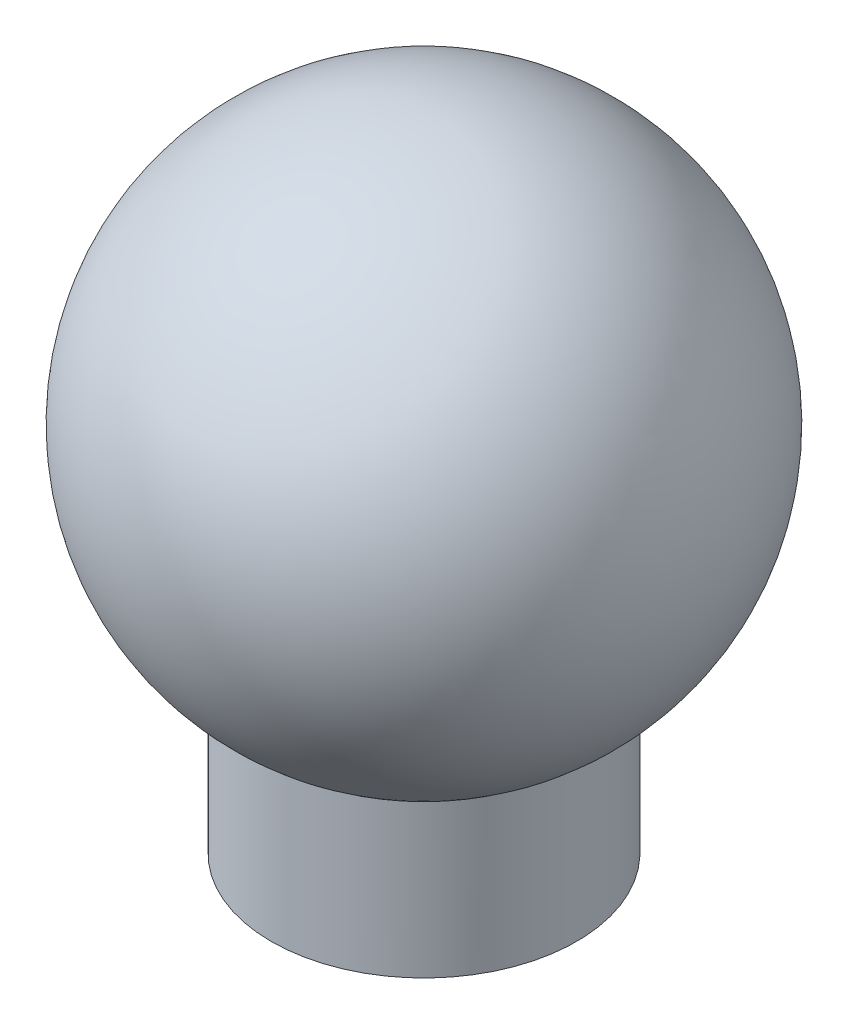
ISO-10303-21;
HEADER;
FILE_DESCRIPTION(('STEP AP214'),'2;1');
FILE_NAME('part.step','',(''),(''),'','','');
FILE_SCHEMA(('AUTOMOTIVE_DESIGN { 1 0 10303 214 1 1 1 1 }'));
ENDSEC;
DATA;
#1=APPLICATION_CONTEXT('core data for automotive mechanical design processes');
#2=APPLICATION_PROTOCOL_DEFINITION('international standard','automotive_design',2000,#1);
#3=PRODUCT_CONTEXT('',#1,'mechanical');
#4=PRODUCT('Part','Part','',(#3));
#5=PRODUCT_RELATED_PRODUCT_CATEGORY('part','',(#4));
#6=PRODUCT_DEFINITION_FORMATION('','',#4);
#7=PRODUCT_DEFINITION_CONTEXT('part definition',#1,'design');
#8=PRODUCT_DEFINITION('design','',#6,#7);
#9=PRODUCT_DEFINITION_SHAPE('','',#8);
#10=(LENGTH_UNIT() NAMED_UNIT(*) SI_UNIT(.MILLI.,.METRE.));
#11=(NAMED_UNIT(*) PLANE_ANGLE_UNIT() SI_UNIT($,.RADIAN.));
#12=(NAMED_UNIT(*) SI_UNIT($,.STERADIAN.) SOLID_ANGLE_UNIT());
#13=UNCERTAINTY_MEASURE_WITH_UNIT(LENGTH_MEASURE(1.E-05),#10,'distance_accuracy_value','');
#14=(GEOMETRIC_REPRESENTATION_CONTEXT(3) GLOBAL_UNCERTAINTY_ASSIGNED_CONTEXT((#13)) GLOBAL_UNIT_ASSIGNED_CONTEXT((#10,
#11,#12)) REPRESENTATION_CONTEXT('',''));
#15=CARTESIAN_POINT('',(0.,0.,0.));
#16=DIRECTION('',(0.,0.,1.));
#17=DIRECTION('',(1.,0.,0.));
#18=AXIS2_PLACEMENT_3D('',#15,#16,#17);
#19=CARTESIAN_POINT('',(0.,25.4,0.));
#20=DIRECTION('',(0.,-1.,0.));
#21=DIRECTION('',(0.,0.,-1.));
#22=AXIS2_PLACEMENT_3D('',#19,#20,#21);
#23=CYLINDRICAL_SURFACE('',#22,25.4);
#24=CARTESIAN_POINT('',(0.,25.4,0.));
#25=DIRECTION('',(0.,1.,0.));
#26=DIRECTION('',(0.,0.,1.));
#27=AXIS2_PLACEMENT_3D('',#24,#25,#26);
#28=CIRCLE('',#27,25.4);
#29=CARTESIAN_POINT('',(0.,25.4,25.4));
#30=VERTEX_POINT('',#29);
#31=EDGE_CURVE('E10',#30,#30,#28,.T.);
#32=ORIENTED_EDGE('',*,*,#31,.F.);
#33=EDGE_LOOP('',(#32));
#34=FACE_BOUND('',#33,.T.);
#35=CARTESIAN_POINT('',(0.,0.,0.));
#36=DIRECTION('',(0.,1.,0.));
#37=DIRECTION('',(0.,0.,1.));
#38=AXIS2_PLACEMENT_3D('',#35,#36,#37);
#39=CIRCLE('',#38,25.4);
#40=CARTESIAN_POINT('',(0.,0.,25.4));
#41=VERTEX_POINT('',#40);
#42=EDGE_CURVE('E37',#41,#41,#39,.T.);
#43=ORIENTED_EDGE('',*,*,#42,.T.);
#44=EDGE_LOOP('',(#43));
#45=FACE_BOUND('',#44,.T.);
#46=ADVANCED_FACE('F34',(#34,#45),#23,.T.);
#47=CARTESIAN_POINT('',(0.,0.,0.));
#48=DIRECTION('',(0.,1.,0.));
#49=DIRECTION('',(0.,0.,1.));
#50=AXIS2_PLACEMENT_3D('',#47,#48,#49);
#51=PLANE('',#50);
#52=ORIENTED_EDGE('',*,*,#42,.F.);
#53=EDGE_LOOP('',(#52));
#54=FACE_BOUND('',#53,.T.);
#55=ADVANCED_FACE('F47',(#54),#51,.F.);
#56=CARTESIAN_POINT('',(0.,61.8779728055165,0.));
#57=DIRECTION('',(0.,1.,0.));
#58=DIRECTION('',(1.,0.,0.));
#59=AXIS2_PLACEMENT_3D('',#56,#57,#58);
#60=SPHERICAL_SURFACE('',#59,44.45);
#61=ORIENTED_EDGE('',*,*,#31,.T.);
#62=EDGE_LOOP('',(#61));
#63=FACE_BOUND('',#62,.T.);
#64=ADVANCED_FACE('F49',(#63),#60,.T.);
#65=CLOSED_SHELL('',(#46,#55,#64));
#66=MANIFOLD_SOLID_BREP('B2',#65);
#67=ADVANCED_BREP_SHAPE_REPRESENTATION('',(#18,#66),#14);
#68=SHAPE_DEFINITION_REPRESENTATION(#9,#67);
ENDSEC;
END-ISO-10303-21;
